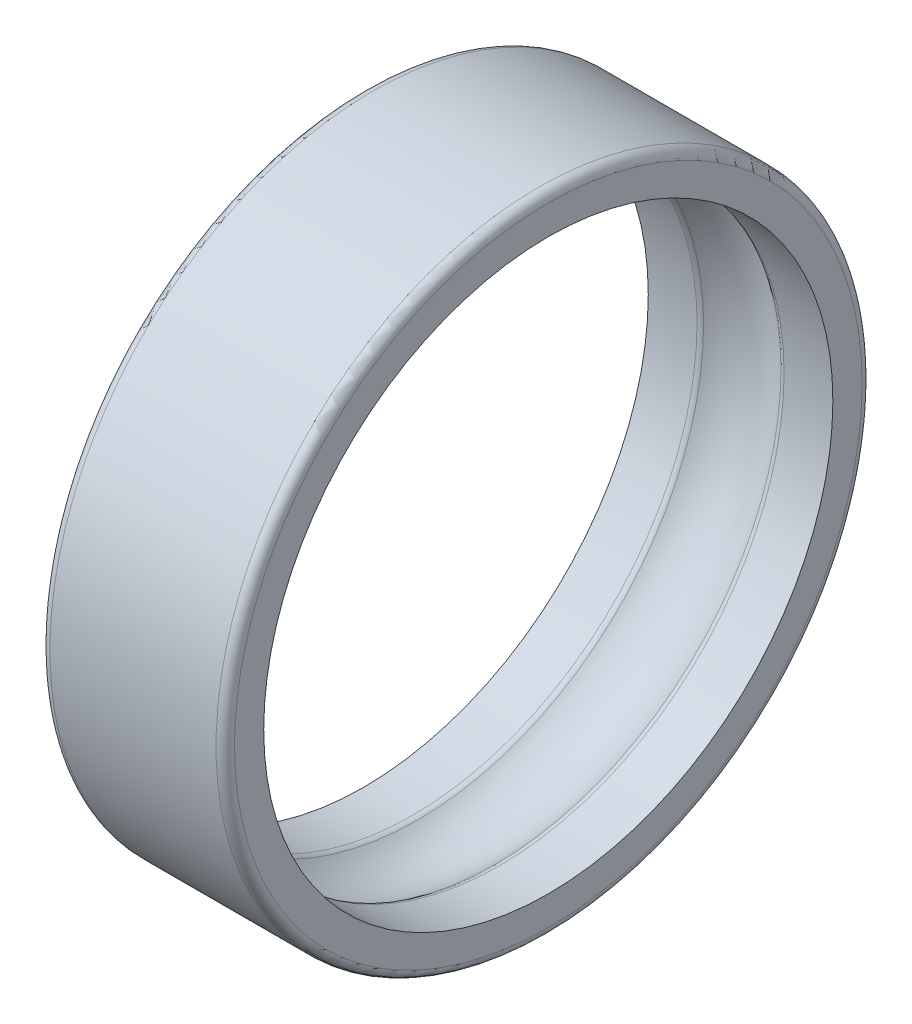
ISO-10303-21;
HEADER;
FILE_DESCRIPTION(('STEP AP214'),'2;1');
FILE_NAME('part.step','',(''),(''),'','','');
FILE_SCHEMA(('AUTOMOTIVE_DESIGN { 1 0 10303 214 1 1 1 1 }'));
ENDSEC;
DATA;
#1=APPLICATION_CONTEXT('core data for automotive mechanical design processes');
#2=APPLICATION_PROTOCOL_DEFINITION('international standard','automotive_design',2000,#1);
#3=PRODUCT_CONTEXT('',#1,'mechanical');
#4=PRODUCT('Part','Part','',(#3));
#5=PRODUCT_RELATED_PRODUCT_CATEGORY('part','',(#4));
#6=PRODUCT_DEFINITION_FORMATION('','',#4);
#7=PRODUCT_DEFINITION_CONTEXT('part definition',#1,'design');
#8=PRODUCT_DEFINITION('design','',#6,#7);
#9=PRODUCT_DEFINITION_SHAPE('','',#8);
#10=(LENGTH_UNIT() NAMED_UNIT(*) SI_UNIT(.MILLI.,.METRE.));
#11=(NAMED_UNIT(*) PLANE_ANGLE_UNIT() SI_UNIT($,.RADIAN.));
#12=(NAMED_UNIT(*) SI_UNIT($,.STERADIAN.) SOLID_ANGLE_UNIT());
#13=UNCERTAINTY_MEASURE_WITH_UNIT(LENGTH_MEASURE(1.E-05),#10,'distance_accuracy_value','');
#14=(GEOMETRIC_REPRESENTATION_CONTEXT(3) GLOBAL_UNCERTAINTY_ASSIGNED_CONTEXT((#13)) GLOBAL_UNIT_ASSIGNED_CONTEXT((#10,
#11,#12)) REPRESENTATION_CONTEXT('',''));
#15=CARTESIAN_POINT('',(0.,0.,0.));
#16=DIRECTION('',(0.,0.,1.));
#17=DIRECTION('',(1.,0.,0.));
#18=AXIS2_PLACEMENT_3D('',#15,#16,#17);
#19=CARTESIAN_POINT('',(0.,-10.7991851168442,0.));
#20=DIRECTION('',(1.,0.,0.));
#21=DIRECTION('',(0.,1.,0.));
#22=AXIS2_PLACEMENT_3D('',#19,#20,#21);
#23=TOROIDAL_SURFACE('',#22,15.5,4.);
#24=CARTESIAN_POINT('',(2.51415744421885,-10.7991851168442,0.));
#25=DIRECTION('',(-1.,0.,0.));
#26=DIRECTION('',(0.,-1.,0.));
#27=AXIS2_PLACEMENT_3D('',#24,#25,#26);
#28=CIRCLE('',#27,18.6111111111112);
#29=CARTESIAN_POINT('',(2.51415744421886,-29.4102962279554,0.));
#30=VERTEX_POINT('',#29);
#31=EDGE_CURVE('E57',#30,#30,#28,.F.);
#32=ORIENTED_EDGE('',*,*,#31,.T.);
#33=EDGE_LOOP('',(#32));
#34=FACE_BOUND('',#33,.T.);
#35=CARTESIAN_POINT('',(-2.51415744421883,-10.7991851168442,0.));
#36=DIRECTION('',(1.,0.,0.));
#37=DIRECTION('',(0.,1.,0.));
#38=AXIS2_PLACEMENT_3D('',#35,#36,#37);
#39=CIRCLE('',#38,18.6111111111112);
#40=CARTESIAN_POINT('',(-2.51415744421883,7.81192599426699,0.));
#41=VERTEX_POINT('',#40);
#42=EDGE_CURVE('E61',#41,#41,#39,.F.);
#43=ORIENTED_EDGE('',*,*,#42,.T.);
#44=EDGE_LOOP('',(#43));
#45=FACE_BOUND('',#44,.T.);
#46=ADVANCED_FACE('F46',(#34,#45),#23,.F.);
#47=CARTESIAN_POINT('',(44.1264439727024,-10.7991851168442,0.));
#48=DIRECTION('',(1.,0.,0.));
#49=DIRECTION('',(0.,1.,0.));
#50=AXIS2_PLACEMENT_3D('',#47,#48,#49);
#51=CYLINDRICAL_SURFACE('',#50,18.5);
#52=CARTESIAN_POINT('',(2.82842712474619,-10.7991851168442,0.));
#53=DIRECTION('',(-1.,0.,0.));
#54=DIRECTION('',(0.,-1.,0.));
#55=AXIS2_PLACEMENT_3D('',#52,#53,#54);
#56=CIRCLE('',#55,18.5);
#57=CARTESIAN_POINT('',(2.8284271247462,-29.2991851168442,0.));
#58=VERTEX_POINT('',#57);
#59=EDGE_CURVE('E53',#58,#58,#56,.T.);
#60=ORIENTED_EDGE('',*,*,#59,.T.);
#61=EDGE_LOOP('',(#60));
#62=FACE_BOUND('',#61,.T.);
#63=CARTESIAN_POINT('',(6.00000000000001,-10.7991851168442,0.));
#64=DIRECTION('',(1.,0.,0.));
#65=DIRECTION('',(0.,1.,0.));
#66=AXIS2_PLACEMENT_3D('',#63,#64,#65);
#67=CIRCLE('',#66,18.5);
#68=CARTESIAN_POINT('',(6.,7.70081488315588,0.));
#69=VERTEX_POINT('',#68);
#70=EDGE_CURVE('E78',#69,#69,#67,.T.);
#71=ORIENTED_EDGE('',*,*,#70,.T.);
#72=EDGE_LOOP('',(#71));
#73=FACE_BOUND('',#72,.T.);
#74=ADVANCED_FACE('F91',(#62,#73),#51,.F.);
#75=CARTESIAN_POINT('',(6.,0.,0.));
#76=DIRECTION('',(-1.,0.,0.));
#77=DIRECTION('',(0.,-1.,0.));
#78=AXIS2_PLACEMENT_3D('',#75,#76,#77);
#79=PLANE('',#78);
#80=CARTESIAN_POINT('',(6.00000000000001,-10.7991851168442,0.));
#81=DIRECTION('',(-1.,0.,0.));
#82=DIRECTION('',(0.,-1.,0.));
#83=AXIS2_PLACEMENT_3D('',#80,#81,#82);
#84=CIRCLE('',#83,20.4);
#85=CARTESIAN_POINT('',(6.00000000000001,-31.1991851168442,0.));
#86=VERTEX_POINT('',#85);
#87=EDGE_CURVE('E66',#86,#86,#84,.F.);
#88=ORIENTED_EDGE('',*,*,#87,.T.);
#89=EDGE_LOOP('',(#88));
#90=FACE_BOUND('',#89,.T.);
#91=ORIENTED_EDGE('',*,*,#70,.F.);
#92=EDGE_LOOP('',(#91));
#93=FACE_BOUND('',#92,.T.);
#94=ADVANCED_FACE('F103',(#90,#93),#79,.F.);
#95=CARTESIAN_POINT('',(44.1264439727024,-10.7991851168442,0.));
#96=DIRECTION('',(1.,0.,0.));
#97=DIRECTION('',(0.,1.,0.));
#98=AXIS2_PLACEMENT_3D('',#95,#96,#97);
#99=CYLINDRICAL_SURFACE('',#98,21.);
#100=CARTESIAN_POINT('',(-5.4,-10.7991851168442,0.));
#101=DIRECTION('',(-1.,0.,0.));
#102=DIRECTION('',(0.,-1.,0.));
#103=AXIS2_PLACEMENT_3D('',#100,#101,#102);
#104=CIRCLE('',#103,21.);
#105=CARTESIAN_POINT('',(-5.39999999999999,-31.7991851168442,0.));
#106=VERTEX_POINT('',#105);
#107=EDGE_CURVE('E72',#106,#106,#104,.F.);
#108=ORIENTED_EDGE('',*,*,#107,.T.);
#109=EDGE_LOOP('',(#108));
#110=FACE_BOUND('',#109,.T.);
#111=CARTESIAN_POINT('',(5.4,-10.7991851168442,0.));
#112=DIRECTION('',(-1.,0.,0.));
#113=DIRECTION('',(0.,-1.,0.));
#114=AXIS2_PLACEMENT_3D('',#111,#112,#113);
#115=CIRCLE('',#114,21.);
#116=CARTESIAN_POINT('',(5.40000000000001,-31.7991851168442,0.));
#117=VERTEX_POINT('',#116);
#118=EDGE_CURVE('E75',#117,#117,#115,.T.);
#119=ORIENTED_EDGE('',*,*,#118,.T.);
#120=EDGE_LOOP('',(#119));
#121=FACE_BOUND('',#120,.T.);
#122=ADVANCED_FACE('F99',(#110,#121),#99,.T.);
#123=CARTESIAN_POINT('',(-6.,0.,0.));
#124=DIRECTION('',(-1.,0.,0.));
#125=DIRECTION('',(0.,-1.,0.));
#126=AXIS2_PLACEMENT_3D('',#123,#124,#125);
#127=PLANE('',#126);
#128=CARTESIAN_POINT('',(-5.99999999999999,-10.7991851168442,0.));
#129=DIRECTION('',(-1.,0.,0.));
#130=DIRECTION('',(0.,-1.,0.));
#131=AXIS2_PLACEMENT_3D('',#128,#129,#130);
#132=CIRCLE('',#131,20.4);
#133=CARTESIAN_POINT('',(-5.99999999999999,-31.1991851168442,0.));
#134=VERTEX_POINT('',#133);
#135=EDGE_CURVE('E69',#134,#134,#132,.T.);
#136=ORIENTED_EDGE('',*,*,#135,.T.);
#137=EDGE_LOOP('',(#136));
#138=FACE_BOUND('',#137,.T.);
#139=CARTESIAN_POINT('',(-5.99999999999999,-10.7991851168442,0.));
#140=DIRECTION('',(1.,0.,0.));
#141=DIRECTION('',(0.,1.,0.));
#142=AXIS2_PLACEMENT_3D('',#139,#140,#141);
#143=CIRCLE('',#142,18.5);
#144=CARTESIAN_POINT('',(-6.,7.70081488315588,0.));
#145=VERTEX_POINT('',#144);
#146=EDGE_CURVE('E81',#145,#145,#143,.T.);
#147=ORIENTED_EDGE('',*,*,#146,.T.);
#148=EDGE_LOOP('',(#147));
#149=FACE_BOUND('',#148,.T.);
#150=ADVANCED_FACE('F85',(#138,#149),#127,.T.);
#151=CARTESIAN_POINT('',(-2.82842712474618,-10.7991851168442,0.));
#152=DIRECTION('',(-1.,0.,0.));
#153=DIRECTION('',(0.,-1.,0.));
#154=AXIS2_PLACEMENT_3D('',#151,#152,#153);
#155=CIRCLE('',#154,18.5);
#156=CARTESIAN_POINT('',(-2.82842712474617,-29.2991851168442,0.));
#157=VERTEX_POINT('',#156);
#158=EDGE_CURVE('E12',#157,#157,#155,.F.);
#159=ORIENTED_EDGE('',*,*,#158,.T.);
#160=EDGE_LOOP('',(#159));
#161=FACE_BOUND('',#160,.T.);
#162=ORIENTED_EDGE('',*,*,#146,.F.);
#163=EDGE_LOOP('',(#162));
#164=FACE_BOUND('',#163,.T.);
#165=ADVANCED_FACE('F87',(#161,#164),#51,.F.);
#166=CARTESIAN_POINT('',(-5.4,-10.7991851168442,0.));
#167=DIRECTION('',(-1.,0.,0.));
#168=DIRECTION('',(0.,-1.,0.));
#169=AXIS2_PLACEMENT_3D('',#166,#167,#168);
#170=TOROIDAL_SURFACE('',#169,20.4,0.6);
#171=ORIENTED_EDGE('',*,*,#135,.F.);
#172=EDGE_LOOP('',(#171));
#173=FACE_BOUND('',#172,.T.);
#174=ORIENTED_EDGE('',*,*,#107,.F.);
#175=EDGE_LOOP('',(#174));
#176=FACE_BOUND('',#175,.T.);
#177=ADVANCED_FACE('F89',(#173,#176),#170,.T.);
#178=CARTESIAN_POINT('',(5.4,-10.7991851168442,0.));
#179=DIRECTION('',(-1.,0.,0.));
#180=DIRECTION('',(0.,-1.,0.));
#181=AXIS2_PLACEMENT_3D('',#178,#179,#180);
#182=TOROIDAL_SURFACE('',#181,20.4,0.6);
#183=ORIENTED_EDGE('',*,*,#118,.F.);
#184=EDGE_LOOP('',(#183));
#185=FACE_BOUND('',#184,.T.);
#186=ORIENTED_EDGE('',*,*,#87,.F.);
#187=EDGE_LOOP('',(#186));
#188=FACE_BOUND('',#187,.T.);
#189=ADVANCED_FACE('F96',(#185,#188),#182,.T.);
#190=CARTESIAN_POINT('',(2.82842712474619,-10.7991851168442,0.));
#191=DIRECTION('',(-1.,0.,0.));
#192=DIRECTION('',(0.,-1.,0.));
#193=AXIS2_PLACEMENT_3D('',#190,#191,#192);
#194=TOROIDAL_SURFACE('',#193,19.0000000000001,0.5);
#195=ORIENTED_EDGE('',*,*,#59,.F.);
#196=EDGE_LOOP('',(#195));
#197=FACE_BOUND('',#196,.T.);
#198=ORIENTED_EDGE('',*,*,#31,.F.);
#199=EDGE_LOOP('',(#198));
#200=FACE_BOUND('',#199,.T.);
#201=ADVANCED_FACE('F114',(#197,#200),#194,.T.);
#202=CARTESIAN_POINT('',(-2.82842712474618,-10.7991851168442,0.));
#203=DIRECTION('',(-1.,0.,0.));
#204=DIRECTION('',(0.,-1.,0.));
#205=AXIS2_PLACEMENT_3D('',#202,#203,#204);
#206=TOROIDAL_SURFACE('',#205,19.0000000000001,0.5);
#207=ORIENTED_EDGE('',*,*,#42,.F.);
#208=EDGE_LOOP('',(#207));
#209=FACE_BOUND('',#208,.T.);
#210=ORIENTED_EDGE('',*,*,#158,.F.);
#211=EDGE_LOOP('',(#210));
#212=FACE_BOUND('',#211,.T.);
#213=ADVANCED_FACE('F48',(#209,#212),#206,.T.);
#214=CLOSED_SHELL('',(#46,#74,#94,#122,#150,#165,#177,#189,#201,#213));
#215=MANIFOLD_SOLID_BREP('B2',#214);
#216=ADVANCED_BREP_SHAPE_REPRESENTATION('',(#18,#215),#14);
#217=SHAPE_DEFINITION_REPRESENTATION(#9,#216);
ENDSEC;
END-ISO-10303-21;
